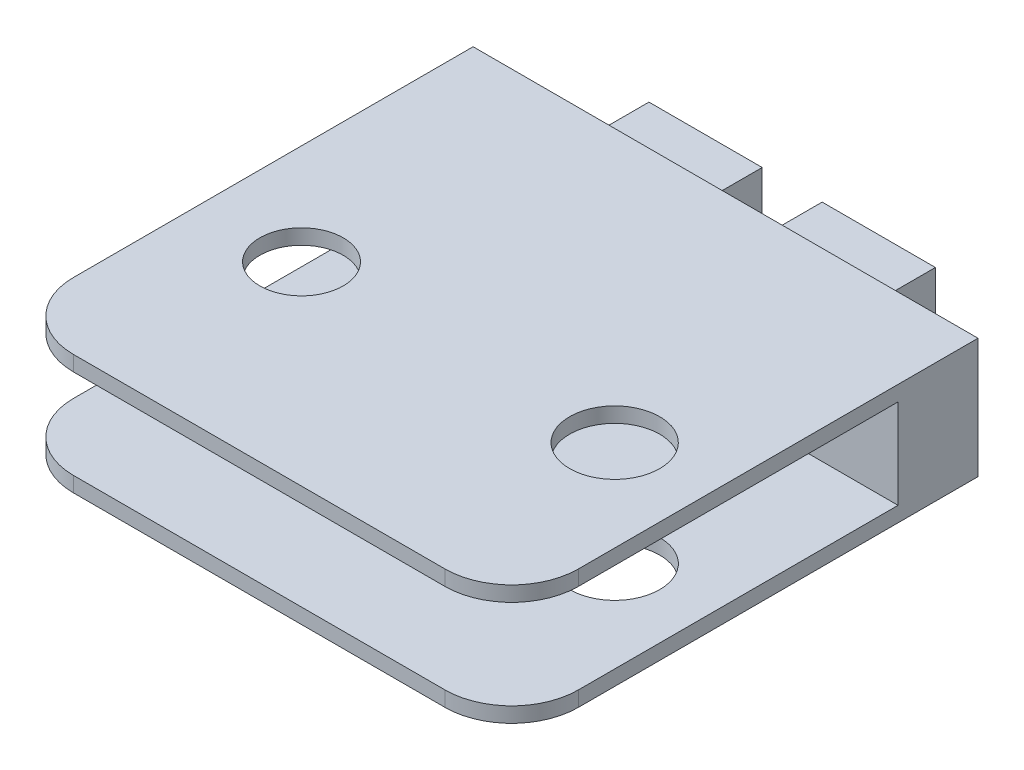
ISO-10303-21;
HEADER;
FILE_DESCRIPTION(('STEP AP214'),'2;1');
FILE_NAME('part.step','',(''),(''),'','','');
FILE_SCHEMA(('AUTOMOTIVE_DESIGN { 1 0 10303 214 1 1 1 1 }'));
ENDSEC;
DATA;
#1=APPLICATION_CONTEXT('core data for automotive mechanical design processes');
#2=APPLICATION_PROTOCOL_DEFINITION('international standard','automotive_design',2000,#1);
#3=PRODUCT_CONTEXT('',#1,'mechanical');
#4=PRODUCT('Part','Part','',(#3));
#5=PRODUCT_RELATED_PRODUCT_CATEGORY('part','',(#4));
#6=PRODUCT_DEFINITION_FORMATION('','',#4);
#7=PRODUCT_DEFINITION_CONTEXT('part definition',#1,'design');
#8=PRODUCT_DEFINITION('design','',#6,#7);
#9=PRODUCT_DEFINITION_SHAPE('','',#8);
#10=(LENGTH_UNIT() NAMED_UNIT(*) SI_UNIT(.MILLI.,.METRE.));
#11=(NAMED_UNIT(*) PLANE_ANGLE_UNIT() SI_UNIT($,.RADIAN.));
#12=(NAMED_UNIT(*) SI_UNIT($,.STERADIAN.) SOLID_ANGLE_UNIT());
#13=UNCERTAINTY_MEASURE_WITH_UNIT(LENGTH_MEASURE(1.E-05),#10,'distance_accuracy_value','');
#14=(GEOMETRIC_REPRESENTATION_CONTEXT(3) GLOBAL_UNCERTAINTY_ASSIGNED_CONTEXT((#13)) GLOBAL_UNIT_ASSIGNED_CONTEXT((#10,
#11,#12)) REPRESENTATION_CONTEXT('',''));
#15=CARTESIAN_POINT('',(0.,0.,0.));
#16=DIRECTION('',(0.,0.,1.));
#17=DIRECTION('',(1.,0.,0.));
#18=AXIS2_PLACEMENT_3D('',#15,#16,#17);
#19=CARTESIAN_POINT('',(0.,0.,-10.));
#20=DIRECTION('',(0.,0.,-1.));
#21=DIRECTION('',(-1.,0.,0.));
#22=AXIS2_PLACEMENT_3D('',#19,#20,#21);
#23=PLANE('',#22);
#24=DIRECTION('',(1.,0.,0.));
#25=VECTOR('',#24,1.);
#26=CARTESIAN_POINT('',(21.5,5.,-10.));
#27=LINE('',#26,#25);
#28=CARTESIAN_POINT('',(4.5,5.,-10.));
#29=VERTEX_POINT('',#28);
#30=CARTESIAN_POINT('',(21.5,5.,-10.));
#31=VERTEX_POINT('',#30);
#32=EDGE_CURVE('E203',#29,#31,#27,.T.);
#33=ORIENTED_EDGE('',*,*,#32,.F.);
#34=DIRECTION('',(0.,1.,0.));
#35=VECTOR('',#34,1.);
#36=CARTESIAN_POINT('',(4.5,5.,-10.));
#37=LINE('',#36,#35);
#38=CARTESIAN_POINT('',(4.5,-5.,-10.));
#39=VERTEX_POINT('',#38);
#40=EDGE_CURVE('E200',#39,#29,#37,.T.);
#41=ORIENTED_EDGE('',*,*,#40,.F.);
#42=DIRECTION('',(-1.,0.,0.));
#43=VECTOR('',#42,1.);
#44=CARTESIAN_POINT('',(21.5,-5.,-10.));
#45=LINE('',#44,#43);
#46=CARTESIAN_POINT('',(21.5,-5.,-10.));
#47=VERTEX_POINT('',#46);
#48=EDGE_CURVE('E213',#47,#39,#45,.T.);
#49=ORIENTED_EDGE('',*,*,#48,.F.);
#50=DIRECTION('',(0.,-1.,0.));
#51=VECTOR('',#50,1.);
#52=CARTESIAN_POINT('',(21.5,5.,-10.));
#53=LINE('',#52,#51);
#54=EDGE_CURVE('E221',#31,#47,#53,.T.);
#55=ORIENTED_EDGE('',*,*,#54,.F.);
#56=EDGE_LOOP('',(#33,#41,#49,#55));
#57=FACE_BOUND('',#56,.T.);
#58=DIRECTION('',(0.,-1.,0.));
#59=VECTOR('',#58,1.);
#60=CARTESIAN_POINT('',(37.895,9.,-10.));
#61=LINE('',#60,#59);
#62=CARTESIAN_POINT('',(37.895,9.,-10.));
#63=VERTEX_POINT('',#62);
#64=CARTESIAN_POINT('',(37.895,-9.,-10.));
#65=VERTEX_POINT('',#64);
#66=EDGE_CURVE('E234',#63,#65,#61,.T.);
#67=ORIENTED_EDGE('',*,*,#66,.T.);
#68=DIRECTION('',(-1.,0.,0.));
#69=VECTOR('',#68,1.);
#70=CARTESIAN_POINT('',(37.895,-9.,-10.));
#71=LINE('',#70,#69);
#72=CARTESIAN_POINT('',(-37.895,-9.,-10.));
#73=VERTEX_POINT('',#72);
#74=EDGE_CURVE('E237',#65,#73,#71,.T.);
#75=ORIENTED_EDGE('',*,*,#74,.T.);
#76=DIRECTION('',(0.,1.,0.));
#77=VECTOR('',#76,1.);
#78=CARTESIAN_POINT('',(-37.895,9.,-10.));
#79=LINE('',#78,#77);
#80=CARTESIAN_POINT('',(-37.895,9.,-10.));
#81=VERTEX_POINT('',#80);
#82=EDGE_CURVE('E240',#73,#81,#79,.T.);
#83=ORIENTED_EDGE('',*,*,#82,.T.);
#84=DIRECTION('',(1.,0.,0.));
#85=VECTOR('',#84,1.);
#86=CARTESIAN_POINT('',(37.895,9.,-10.));
#87=LINE('',#86,#85);
#88=EDGE_CURVE('E243',#81,#63,#87,.T.);
#89=ORIENTED_EDGE('',*,*,#88,.T.);
#90=EDGE_LOOP('',(#67,#75,#83,#89));
#91=FACE_BOUND('',#90,.T.);
#92=DIRECTION('',(1.,0.,0.));
#93=VECTOR('',#92,1.);
#94=CARTESIAN_POINT('',(-4.5,5.,-10.));
#95=LINE('',#94,#93);
#96=CARTESIAN_POINT('',(-21.5,5.,-10.));
#97=VERTEX_POINT('',#96);
#98=CARTESIAN_POINT('',(-4.5,5.,-10.));
#99=VERTEX_POINT('',#98);
#100=EDGE_CURVE('E662',#97,#99,#95,.T.);
#101=ORIENTED_EDGE('',*,*,#100,.F.);
#102=DIRECTION('',(0.,1.,0.));
#103=VECTOR('',#102,1.);
#104=CARTESIAN_POINT('',(-21.5,5.,-10.));
#105=LINE('',#104,#103);
#106=CARTESIAN_POINT('',(-21.5,-5.,-10.));
#107=VERTEX_POINT('',#106);
#108=EDGE_CURVE('E198',#107,#97,#105,.T.);
#109=ORIENTED_EDGE('',*,*,#108,.F.);
#110=DIRECTION('',(-1.,0.,0.));
#111=VECTOR('',#110,1.);
#112=CARTESIAN_POINT('',(-4.5,-5.,-10.));
#113=LINE('',#112,#111);
#114=CARTESIAN_POINT('',(-4.5,-5.,-10.));
#115=VERTEX_POINT('',#114);
#116=EDGE_CURVE('E194',#115,#107,#113,.T.);
#117=ORIENTED_EDGE('',*,*,#116,.F.);
#118=DIRECTION('',(0.,-1.,0.));
#119=VECTOR('',#118,1.);
#120=CARTESIAN_POINT('',(-4.5,5.,-10.));
#121=LINE('',#120,#119);
#122=EDGE_CURVE('E660',#99,#115,#121,.T.);
#123=ORIENTED_EDGE('',*,*,#122,.F.);
#124=EDGE_LOOP('',(#101,#109,#117,#123));
#125=FACE_BOUND('',#124,.T.);
#126=ADVANCED_FACE('F39',(#57,#91,#125),#23,.T.);
#127=CARTESIAN_POINT('',(0.,0.,60.));
#128=DIRECTION('',(0.,0.,1.));
#129=DIRECTION('',(1.,0.,0.));
#130=AXIS2_PLACEMENT_3D('',#127,#128,#129);
#131=PLANE('',#130);
#132=DIRECTION('',(-1.,0.,0.));
#133=VECTOR('',#132,1.);
#134=CARTESIAN_POINT('',(-37.895,6.725,60.));
#135=LINE('',#134,#133);
#136=CARTESIAN_POINT('',(27.895,6.725,60.));
#137=VERTEX_POINT('',#136);
#138=CARTESIAN_POINT('',(-27.895,6.725,60.));
#139=VERTEX_POINT('',#138);
#140=EDGE_CURVE('E271',#137,#139,#135,.T.);
#141=ORIENTED_EDGE('',*,*,#140,.F.);
#142=DIRECTION('',(0.,1.,0.));
#143=VECTOR('',#142,1.);
#144=CARTESIAN_POINT('',(27.895,9.,60.));
#145=LINE('',#144,#143);
#146=CARTESIAN_POINT('',(27.895,9.,60.));
#147=VERTEX_POINT('',#146);
#148=EDGE_CURVE('E315',#137,#147,#145,.T.);
#149=ORIENTED_EDGE('',*,*,#148,.T.);
#150=DIRECTION('',(-1.,0.,0.));
#151=VECTOR('',#150,1.);
#152=CARTESIAN_POINT('',(-37.895,9.,60.));
#153=LINE('',#152,#151);
#154=CARTESIAN_POINT('',(-27.895,9.,60.));
#155=VERTEX_POINT('',#154);
#156=EDGE_CURVE('E287',#147,#155,#153,.T.);
#157=ORIENTED_EDGE('',*,*,#156,.T.);
#158=DIRECTION('',(0.,-1.,0.));
#159=VECTOR('',#158,1.);
#160=CARTESIAN_POINT('',(-27.895,6.725,60.));
#161=LINE('',#160,#159);
#162=EDGE_CURVE('E308',#155,#139,#161,.T.);
#163=ORIENTED_EDGE('',*,*,#162,.T.);
#164=EDGE_LOOP('',(#141,#149,#157,#163));
#165=FACE_BOUND('',#164,.T.);
#166=ADVANCED_FACE('F356',(#165),#131,.T.);
#167=CARTESIAN_POINT('',(37.895,9.,60.));
#168=DIRECTION('',(-1.,0.,0.));
#169=DIRECTION('',(0.,0.,1.));
#170=AXIS2_PLACEMENT_3D('',#167,#168,#169);
#171=PLANE('',#170);
#172=DIRECTION('',(0.,0.,-1.));
#173=VECTOR('',#172,1.);
#174=CARTESIAN_POINT('',(37.895,9.,60.));
#175=LINE('',#174,#173);
#176=CARTESIAN_POINT('',(37.895,9.,50.));
#177=VERTEX_POINT('',#176);
#178=EDGE_CURVE('E306',#177,#63,#175,.T.);
#179=ORIENTED_EDGE('',*,*,#178,.F.);
#180=DIRECTION('',(0.,1.,0.));
#181=VECTOR('',#180,1.);
#182=CARTESIAN_POINT('',(37.895,6.725,50.));
#183=LINE('',#182,#181);
#184=CARTESIAN_POINT('',(37.895,6.725,50.));
#185=VERTEX_POINT('',#184);
#186=EDGE_CURVE('E324',#177,#185,#183,.F.);
#187=ORIENTED_EDGE('',*,*,#186,.T.);
#188=DIRECTION('',(0.,0.,1.));
#189=VECTOR('',#188,1.);
#190=CARTESIAN_POINT('',(37.895,6.725,1.99999999999999));
#191=LINE('',#190,#189);
#192=CARTESIAN_POINT('',(37.895,6.725,1.99999999999999));
#193=VERTEX_POINT('',#192);
#194=EDGE_CURVE('E288',#193,#185,#191,.T.);
#195=ORIENTED_EDGE('',*,*,#194,.F.);
#196=DIRECTION('',(0.,1.,0.));
#197=VECTOR('',#196,1.);
#198=CARTESIAN_POINT('',(37.895,6.725,1.99999999999999));
#199=LINE('',#198,#197);
#200=CARTESIAN_POINT('',(37.895,-6.725,1.99999999999999));
#201=VERTEX_POINT('',#200);
#202=EDGE_CURVE('E274',#201,#193,#199,.T.);
#203=ORIENTED_EDGE('',*,*,#202,.F.);
#204=DIRECTION('',(0.,0.,1.));
#205=VECTOR('',#204,1.);
#206=CARTESIAN_POINT('',(37.895,-6.725,1.99999999999999));
#207=LINE('',#206,#205);
#208=CARTESIAN_POINT('',(37.895,-6.725,50.));
#209=VERTEX_POINT('',#208);
#210=EDGE_CURVE('E291',#201,#209,#207,.T.);
#211=ORIENTED_EDGE('',*,*,#210,.T.);
#212=DIRECTION('',(0.,1.,0.));
#213=VECTOR('',#212,1.);
#214=CARTESIAN_POINT('',(37.895,-9.,50.));
#215=LINE('',#214,#213);
#216=CARTESIAN_POINT('',(37.895,-9.,50.));
#217=VERTEX_POINT('',#216);
#218=EDGE_CURVE('E322',#209,#217,#215,.F.);
#219=ORIENTED_EDGE('',*,*,#218,.T.);
#220=DIRECTION('',(0.,0.,-1.));
#221=VECTOR('',#220,1.);
#222=CARTESIAN_POINT('',(37.895,-9.,60.));
#223=LINE('',#222,#221);
#224=EDGE_CURVE('E300',#217,#65,#223,.T.);
#225=ORIENTED_EDGE('',*,*,#224,.T.);
#226=ORIENTED_EDGE('',*,*,#66,.F.);
#227=EDGE_LOOP('',(#179,#187,#195,#203,#211,#219,#225,#226));
#228=FACE_BOUND('',#227,.T.);
#229=ADVANCED_FACE('F369',(#228),#171,.F.);
#230=CARTESIAN_POINT('',(-37.895,9.,60.));
#231=DIRECTION('',(0.,-1.,0.));
#232=DIRECTION('',(0.,0.,-1.));
#233=AXIS2_PLACEMENT_3D('',#230,#231,#232);
#234=PLANE('',#233);
#235=CARTESIAN_POINT('',(24.1990951042222,9.,30.8441183277008));
#236=DIRECTION('',(0.,1.,0.));
#237=DIRECTION('',(0.,0.,1.));
#238=AXIS2_PLACEMENT_3D('',#235,#236,#237);
#239=CIRCLE('',#238,6.76086956514155);
#240=CARTESIAN_POINT('',(24.1990951042222,9.,37.6049878928423));
#241=VERTEX_POINT('',#240);
#242=EDGE_CURVE('E246',#241,#241,#239,.T.);
#243=ORIENTED_EDGE('',*,*,#242,.F.);
#244=EDGE_LOOP('',(#243));
#245=FACE_BOUND('',#244,.T.);
#246=CARTESIAN_POINT('',(-22.8078017066237,9.,30.8441183277008));
#247=DIRECTION('',(0.,1.,0.));
#248=DIRECTION('',(0.,0.,1.));
#249=AXIS2_PLACEMENT_3D('',#246,#247,#248);
#250=CIRCLE('',#249,6.26086956521739);
#251=CARTESIAN_POINT('',(-22.8078017066237,9.,37.1049878929182));
#252=VERTEX_POINT('',#251);
#253=EDGE_CURVE('E256',#252,#252,#250,.T.);
#254=ORIENTED_EDGE('',*,*,#253,.F.);
#255=EDGE_LOOP('',(#254));
#256=FACE_BOUND('',#255,.T.);
#257=ORIENTED_EDGE('',*,*,#156,.F.);
#258=CARTESIAN_POINT('',(27.895,9.,50.));
#259=DIRECTION('',(0.,-1.,0.));
#260=DIRECTION('',(0.,0.,-1.));
#261=AXIS2_PLACEMENT_3D('',#258,#259,#260);
#262=CIRCLE('',#261,10.);
#263=EDGE_CURVE('E320',#147,#177,#262,.F.);
#264=ORIENTED_EDGE('',*,*,#263,.T.);
#265=ORIENTED_EDGE('',*,*,#178,.T.);
#266=ORIENTED_EDGE('',*,*,#88,.F.);
#267=DIRECTION('',(0.,0.,-1.));
#268=VECTOR('',#267,1.);
#269=CARTESIAN_POINT('',(-37.895,9.,60.));
#270=LINE('',#269,#268);
#271=CARTESIAN_POINT('',(-37.895,9.,50.));
#272=VERTEX_POINT('',#271);
#273=EDGE_CURVE('E304',#272,#81,#270,.T.);
#274=ORIENTED_EDGE('',*,*,#273,.F.);
#275=CARTESIAN_POINT('',(-27.895,9.,50.));
#276=DIRECTION('',(0.,-1.,0.));
#277=DIRECTION('',(0.,0.,-1.));
#278=AXIS2_PLACEMENT_3D('',#275,#276,#277);
#279=CIRCLE('',#278,10.);
#280=EDGE_CURVE('E318',#272,#155,#279,.F.);
#281=ORIENTED_EDGE('',*,*,#280,.T.);
#282=EDGE_LOOP('',(#257,#264,#265,#266,#274,#281));
#283=FACE_BOUND('',#282,.T.);
#284=ADVANCED_FACE('F352',(#245,#256,#283),#234,.F.);
#285=CARTESIAN_POINT('',(-37.895,9.,60.));
#286=DIRECTION('',(1.,0.,0.));
#287=DIRECTION('',(0.,0.,-1.));
#288=AXIS2_PLACEMENT_3D('',#285,#286,#287);
#289=PLANE('',#288);
#290=DIRECTION('',(0.,0.,-1.));
#291=VECTOR('',#290,1.);
#292=CARTESIAN_POINT('',(-37.895,-9.,60.));
#293=LINE('',#292,#291);
#294=CARTESIAN_POINT('',(-37.895,-9.,50.));
#295=VERTEX_POINT('',#294);
#296=EDGE_CURVE('E302',#295,#73,#293,.T.);
#297=ORIENTED_EDGE('',*,*,#296,.F.);
#298=DIRECTION('',(0.,-1.,0.));
#299=VECTOR('',#298,1.);
#300=CARTESIAN_POINT('',(-37.895,-6.725,50.));
#301=LINE('',#300,#299);
#302=CARTESIAN_POINT('',(-37.895,-6.725,50.));
#303=VERTEX_POINT('',#302);
#304=EDGE_CURVE('E11',#295,#303,#301,.F.);
#305=ORIENTED_EDGE('',*,*,#304,.T.);
#306=DIRECTION('',(0.,0.,1.));
#307=VECTOR('',#306,1.);
#308=CARTESIAN_POINT('',(-37.895,-6.725,1.99999999999999));
#309=LINE('',#308,#307);
#310=CARTESIAN_POINT('',(-37.895,-6.725,1.99999999999999));
#311=VERTEX_POINT('',#310);
#312=EDGE_CURVE('E279',#311,#303,#309,.T.);
#313=ORIENTED_EDGE('',*,*,#312,.F.);
#314=DIRECTION('',(0.,-1.,0.));
#315=VECTOR('',#314,1.);
#316=CARTESIAN_POINT('',(-37.895,6.725,1.99999999999999));
#317=LINE('',#316,#315);
#318=CARTESIAN_POINT('',(-37.895,6.725,1.99999999999999));
#319=VERTEX_POINT('',#318);
#320=EDGE_CURVE('E267',#319,#311,#317,.T.);
#321=ORIENTED_EDGE('',*,*,#320,.F.);
#322=DIRECTION('',(0.,0.,1.));
#323=VECTOR('',#322,1.);
#324=CARTESIAN_POINT('',(-37.895,6.725,1.99999999999999));
#325=LINE('',#324,#323);
#326=CARTESIAN_POINT('',(-37.895,6.725,50.));
#327=VERTEX_POINT('',#326);
#328=EDGE_CURVE('E284',#319,#327,#325,.T.);
#329=ORIENTED_EDGE('',*,*,#328,.T.);
#330=DIRECTION('',(0.,-1.,0.));
#331=VECTOR('',#330,1.);
#332=CARTESIAN_POINT('',(-37.895,9.,50.));
#333=LINE('',#332,#331);
#334=EDGE_CURVE('E47',#327,#272,#333,.F.);
#335=ORIENTED_EDGE('',*,*,#334,.T.);
#336=ORIENTED_EDGE('',*,*,#273,.T.);
#337=ORIENTED_EDGE('',*,*,#82,.F.);
#338=EDGE_LOOP('',(#297,#305,#313,#321,#329,#335,#336,#337));
#339=FACE_BOUND('',#338,.T.);
#340=ADVANCED_FACE('F344',(#339),#289,.F.);
#341=CARTESIAN_POINT('',(-37.895,-9.,60.));
#342=DIRECTION('',(0.,1.,0.));
#343=DIRECTION('',(0.,0.,1.));
#344=AXIS2_PLACEMENT_3D('',#341,#342,#343);
#345=PLANE('',#344);
#346=CARTESIAN_POINT('',(24.1990951042222,-9.,30.8441183277008));
#347=DIRECTION('',(0.,1.,0.));
#348=DIRECTION('',(0.,0.,1.));
#349=AXIS2_PLACEMENT_3D('',#346,#347,#348);
#350=CIRCLE('',#349,6.76086956514155);
#351=CARTESIAN_POINT('',(24.1990951042222,-9.,37.6049878928423));
#352=VERTEX_POINT('',#351);
#353=EDGE_CURVE('E247',#352,#352,#350,.T.);
#354=ORIENTED_EDGE('',*,*,#353,.T.);
#355=EDGE_LOOP('',(#354));
#356=FACE_BOUND('',#355,.T.);
#357=CARTESIAN_POINT('',(-22.8078017066237,-9.,30.8441183277008));
#358=DIRECTION('',(0.,1.,0.));
#359=DIRECTION('',(0.,0.,1.));
#360=AXIS2_PLACEMENT_3D('',#357,#358,#359);
#361=CIRCLE('',#360,6.26086956521739);
#362=CARTESIAN_POINT('',(-22.8078017066237,-9.,37.1049878929182));
#363=VERTEX_POINT('',#362);
#364=EDGE_CURVE('E257',#363,#363,#361,.T.);
#365=ORIENTED_EDGE('',*,*,#364,.T.);
#366=EDGE_LOOP('',(#365));
#367=FACE_BOUND('',#366,.T.);
#368=ORIENTED_EDGE('',*,*,#224,.F.);
#369=CARTESIAN_POINT('',(27.895,-9.,50.));
#370=DIRECTION('',(0.,1.,0.));
#371=DIRECTION('',(0.,0.,1.));
#372=AXIS2_PLACEMENT_3D('',#369,#370,#371);
#373=CIRCLE('',#372,10.);
#374=CARTESIAN_POINT('',(27.895,-9.,60.));
#375=VERTEX_POINT('',#374);
#376=EDGE_CURVE('E341',#217,#375,#373,.F.);
#377=ORIENTED_EDGE('',*,*,#376,.T.);
#378=DIRECTION('',(1.,0.,0.));
#379=VECTOR('',#378,1.);
#380=CARTESIAN_POINT('',(-37.895,-9.,60.));
#381=LINE('',#380,#379);
#382=CARTESIAN_POINT('',(-27.895,-9.,60.));
#383=VERTEX_POINT('',#382);
#384=EDGE_CURVE('E297',#383,#375,#381,.T.);
#385=ORIENTED_EDGE('',*,*,#384,.F.);
#386=CARTESIAN_POINT('',(-27.895,-9.,50.));
#387=DIRECTION('',(0.,1.,0.));
#388=DIRECTION('',(0.,0.,1.));
#389=AXIS2_PLACEMENT_3D('',#386,#387,#388);
#390=CIRCLE('',#389,10.);
#391=EDGE_CURVE('E54',#383,#295,#390,.F.);
#392=ORIENTED_EDGE('',*,*,#391,.T.);
#393=ORIENTED_EDGE('',*,*,#296,.T.);
#394=ORIENTED_EDGE('',*,*,#74,.F.);
#395=EDGE_LOOP('',(#368,#377,#385,#392,#393,#394));
#396=FACE_BOUND('',#395,.T.);
#397=ADVANCED_FACE('F435',(#356,#367,#396),#345,.F.);
#398=ORIENTED_EDGE('',*,*,#384,.T.);
#399=DIRECTION('',(0.,1.,0.));
#400=VECTOR('',#399,1.);
#401=CARTESIAN_POINT('',(27.895,-6.725,60.));
#402=LINE('',#401,#400);
#403=CARTESIAN_POINT('',(27.895,-6.725,60.));
#404=VERTEX_POINT('',#403);
#405=EDGE_CURVE('E333',#375,#404,#402,.T.);
#406=ORIENTED_EDGE('',*,*,#405,.T.);
#407=DIRECTION('',(1.,0.,0.));
#408=VECTOR('',#407,1.);
#409=CARTESIAN_POINT('',(-37.895,-6.725,60.));
#410=LINE('',#409,#408);
#411=CARTESIAN_POINT('',(-27.895,-6.725,60.));
#412=VERTEX_POINT('',#411);
#413=EDGE_CURVE('E266',#412,#404,#410,.T.);
#414=ORIENTED_EDGE('',*,*,#413,.F.);
#415=DIRECTION('',(0.,-1.,0.));
#416=VECTOR('',#415,1.);
#417=CARTESIAN_POINT('',(-27.895,-9.,60.));
#418=LINE('',#417,#416);
#419=EDGE_CURVE('E330',#412,#383,#418,.T.);
#420=ORIENTED_EDGE('',*,*,#419,.T.);
#421=EDGE_LOOP('',(#398,#406,#414,#420));
#422=FACE_BOUND('',#421,.T.);
#423=ADVANCED_FACE('F382',(#422),#131,.T.);
#424=CARTESIAN_POINT('',(-37.895,6.725,1.99999999999999));
#425=DIRECTION('',(0.,1.,0.));
#426=DIRECTION('',(0.,0.,1.));
#427=AXIS2_PLACEMENT_3D('',#424,#425,#426);
#428=PLANE('',#427);
#429=CARTESIAN_POINT('',(24.1990951042222,6.725,30.8441183277008));
#430=DIRECTION('',(0.,1.,0.));
#431=DIRECTION('',(0.,0.,1.));
#432=AXIS2_PLACEMENT_3D('',#429,#430,#431);
#433=CIRCLE('',#432,6.76086956514155);
#434=CARTESIAN_POINT('',(24.1990951042222,6.725,37.6049878928423));
#435=VERTEX_POINT('',#434);
#436=EDGE_CURVE('E253',#435,#435,#433,.T.);
#437=ORIENTED_EDGE('',*,*,#436,.T.);
#438=EDGE_LOOP('',(#437));
#439=FACE_BOUND('',#438,.T.);
#440=CARTESIAN_POINT('',(-22.8078017066237,6.725,30.8441183277008));
#441=DIRECTION('',(0.,1.,0.));
#442=DIRECTION('',(0.,0.,1.));
#443=AXIS2_PLACEMENT_3D('',#440,#441,#442);
#444=CIRCLE('',#443,6.26086956521739);
#445=CARTESIAN_POINT('',(-22.8078017066237,6.725,37.1049878929182));
#446=VERTEX_POINT('',#445);
#447=EDGE_CURVE('E263',#446,#446,#444,.T.);
#448=ORIENTED_EDGE('',*,*,#447,.T.);
#449=EDGE_LOOP('',(#448));
#450=FACE_BOUND('',#449,.T.);
#451=ORIENTED_EDGE('',*,*,#194,.T.);
#452=CARTESIAN_POINT('',(27.895,6.725,50.));
#453=DIRECTION('',(0.,1.,0.));
#454=DIRECTION('',(0.,0.,1.));
#455=AXIS2_PLACEMENT_3D('',#452,#453,#454);
#456=CIRCLE('',#455,10.);
#457=EDGE_CURVE('E328',#185,#137,#456,.F.);
#458=ORIENTED_EDGE('',*,*,#457,.T.);
#459=ORIENTED_EDGE('',*,*,#140,.T.);
#460=CARTESIAN_POINT('',(-27.895,6.725,50.));
#461=DIRECTION('',(0.,1.,0.));
#462=DIRECTION('',(0.,0.,1.));
#463=AXIS2_PLACEMENT_3D('',#460,#461,#462);
#464=CIRCLE('',#463,10.);
#465=EDGE_CURVE('E326',#139,#327,#464,.F.);
#466=ORIENTED_EDGE('',*,*,#465,.T.);
#467=ORIENTED_EDGE('',*,*,#328,.F.);
#468=DIRECTION('',(-1.,0.,0.));
#469=VECTOR('',#468,1.);
#470=CARTESIAN_POINT('',(-37.895,6.725,1.99999999999999));
#471=LINE('',#470,#469);
#472=EDGE_CURVE('E276',#193,#319,#471,.T.);
#473=ORIENTED_EDGE('',*,*,#472,.F.);
#474=EDGE_LOOP('',(#451,#458,#459,#466,#467,#473));
#475=FACE_BOUND('',#474,.T.);
#476=ADVANCED_FACE('F359',(#439,#450,#475),#428,.F.);
#477=CARTESIAN_POINT('',(-37.895,-6.725,1.99999999999999));
#478=DIRECTION('',(0.,-1.,0.));
#479=DIRECTION('',(0.,0.,-1.));
#480=AXIS2_PLACEMENT_3D('',#477,#478,#479);
#481=PLANE('',#480);
#482=CARTESIAN_POINT('',(24.1990951042222,-6.725,30.8441183277008));
#483=DIRECTION('',(0.,-1.,0.));
#484=DIRECTION('',(0.,0.,-1.));
#485=AXIS2_PLACEMENT_3D('',#482,#483,#484);
#486=CIRCLE('',#485,6.76086956514155);
#487=CARTESIAN_POINT('',(24.1990951042222,-6.725,24.0832487625592));
#488=VERTEX_POINT('',#487);
#489=EDGE_CURVE('E250',#488,#488,#486,.T.);
#490=ORIENTED_EDGE('',*,*,#489,.T.);
#491=EDGE_LOOP('',(#490));
#492=FACE_BOUND('',#491,.T.);
#493=CARTESIAN_POINT('',(-22.8078017066237,-6.725,30.8441183277008));
#494=DIRECTION('',(0.,-1.,0.));
#495=DIRECTION('',(0.,0.,-1.));
#496=AXIS2_PLACEMENT_3D('',#493,#494,#495);
#497=CIRCLE('',#496,6.26086956521739);
#498=CARTESIAN_POINT('',(-22.8078017066237,-6.725,24.5832487624834));
#499=VERTEX_POINT('',#498);
#500=EDGE_CURVE('E260',#499,#499,#497,.T.);
#501=ORIENTED_EDGE('',*,*,#500,.T.);
#502=EDGE_LOOP('',(#501));
#503=FACE_BOUND('',#502,.T.);
#504=ORIENTED_EDGE('',*,*,#413,.T.);
#505=CARTESIAN_POINT('',(27.895,-6.725,50.));
#506=DIRECTION('',(0.,-1.,0.));
#507=DIRECTION('',(0.,0.,-1.));
#508=AXIS2_PLACEMENT_3D('',#505,#506,#507);
#509=CIRCLE('',#508,10.);
#510=EDGE_CURVE('E338',#404,#209,#509,.F.);
#511=ORIENTED_EDGE('',*,*,#510,.T.);
#512=ORIENTED_EDGE('',*,*,#210,.F.);
#513=DIRECTION('',(1.,0.,0.));
#514=VECTOR('',#513,1.);
#515=CARTESIAN_POINT('',(-37.895,-6.725,1.99999999999999));
#516=LINE('',#515,#514);
#517=EDGE_CURVE('E270',#311,#201,#516,.T.);
#518=ORIENTED_EDGE('',*,*,#517,.F.);
#519=ORIENTED_EDGE('',*,*,#312,.T.);
#520=CARTESIAN_POINT('',(-27.895,-6.725,50.));
#521=DIRECTION('',(0.,-1.,0.));
#522=DIRECTION('',(0.,0.,-1.));
#523=AXIS2_PLACEMENT_3D('',#520,#521,#522);
#524=CIRCLE('',#523,10.);
#525=EDGE_CURVE('E336',#303,#412,#524,.F.);
#526=ORIENTED_EDGE('',*,*,#525,.T.);
#527=EDGE_LOOP('',(#504,#511,#512,#518,#519,#526));
#528=FACE_BOUND('',#527,.T.);
#529=ADVANCED_FACE('F380',(#492,#503,#528),#481,.F.);
#530=CARTESIAN_POINT('',(0.,0.,1.99999999999999));
#531=DIRECTION('',(0.,0.,1.));
#532=DIRECTION('',(1.,0.,0.));
#533=AXIS2_PLACEMENT_3D('',#530,#531,#532);
#534=PLANE('',#533);
#535=ORIENTED_EDGE('',*,*,#320,.T.);
#536=ORIENTED_EDGE('',*,*,#517,.T.);
#537=ORIENTED_EDGE('',*,*,#202,.T.);
#538=ORIENTED_EDGE('',*,*,#472,.T.);
#539=EDGE_LOOP('',(#535,#536,#537,#538));
#540=FACE_BOUND('',#539,.T.);
#541=ADVANCED_FACE('F390',(#540),#534,.T.);
#542=CARTESIAN_POINT('',(-22.8078017066237,-9.,30.8441183277008));
#543=DIRECTION('',(0.,1.,0.));
#544=DIRECTION('',(0.,0.,1.));
#545=AXIS2_PLACEMENT_3D('',#542,#543,#544);
#546=CYLINDRICAL_SURFACE('',#545,6.26086956521739);
#547=ORIENTED_EDGE('',*,*,#364,.F.);
#548=EDGE_LOOP('',(#547));
#549=FACE_BOUND('',#548,.T.);
#550=ORIENTED_EDGE('',*,*,#500,.F.);
#551=EDGE_LOOP('',(#550));
#552=FACE_BOUND('',#551,.T.);
#553=ADVANCED_FACE('F392',(#549,#552),#546,.F.);
#554=ORIENTED_EDGE('',*,*,#253,.T.);
#555=EDGE_LOOP('',(#554));
#556=FACE_BOUND('',#555,.T.);
#557=ORIENTED_EDGE('',*,*,#447,.F.);
#558=EDGE_LOOP('',(#557));
#559=FACE_BOUND('',#558,.T.);
#560=ADVANCED_FACE('F398',(#556,#559),#546,.F.);
#561=CARTESIAN_POINT('',(24.1990951042222,-9.,30.8441183277008));
#562=DIRECTION('',(0.,1.,0.));
#563=DIRECTION('',(0.,0.,1.));
#564=AXIS2_PLACEMENT_3D('',#561,#562,#563);
#565=CYLINDRICAL_SURFACE('',#564,6.76086956514155);
#566=ORIENTED_EDGE('',*,*,#353,.F.);
#567=EDGE_LOOP('',(#566));
#568=FACE_BOUND('',#567,.T.);
#569=ORIENTED_EDGE('',*,*,#489,.F.);
#570=EDGE_LOOP('',(#569));
#571=FACE_BOUND('',#570,.T.);
#572=ADVANCED_FACE('F418',(#568,#571),#565,.F.);
#573=ORIENTED_EDGE('',*,*,#242,.T.);
#574=EDGE_LOOP('',(#573));
#575=FACE_BOUND('',#574,.T.);
#576=ORIENTED_EDGE('',*,*,#436,.F.);
#577=EDGE_LOOP('',(#576));
#578=FACE_BOUND('',#577,.T.);
#579=ADVANCED_FACE('F416',(#575,#578),#565,.F.);
#580=CARTESIAN_POINT('',(4.5,5.,-20.));
#581=DIRECTION('',(1.,0.,0.));
#582=DIRECTION('',(0.,0.,-1.));
#583=AXIS2_PLACEMENT_3D('',#580,#581,#582);
#584=PLANE('',#583);
#585=ORIENTED_EDGE('',*,*,#40,.T.);
#586=DIRECTION('',(0.,0.,1.));
#587=VECTOR('',#586,1.);
#588=CARTESIAN_POINT('',(4.5,5.,-20.));
#589=LINE('',#588,#587);
#590=CARTESIAN_POINT('',(4.5,5.,-20.));
#591=VERTEX_POINT('',#590);
#592=EDGE_CURVE('E232',#591,#29,#589,.T.);
#593=ORIENTED_EDGE('',*,*,#592,.F.);
#594=DIRECTION('',(0.,1.,0.));
#595=VECTOR('',#594,1.);
#596=CARTESIAN_POINT('',(4.5,5.,-20.));
#597=LINE('',#596,#595);
#598=CARTESIAN_POINT('',(4.5,-5.,-20.));
#599=VERTEX_POINT('',#598);
#600=EDGE_CURVE('E209',#599,#591,#597,.T.);
#601=ORIENTED_EDGE('',*,*,#600,.F.);
#602=DIRECTION('',(0.,0.,1.));
#603=VECTOR('',#602,1.);
#604=CARTESIAN_POINT('',(4.5,-5.,-20.));
#605=LINE('',#604,#603);
#606=EDGE_CURVE('E218',#599,#39,#605,.T.);
#607=ORIENTED_EDGE('',*,*,#606,.T.);
#608=EDGE_LOOP('',(#585,#593,#601,#607));
#609=FACE_BOUND('',#608,.T.);
#610=ADVANCED_FACE('F414',(#609),#584,.F.);
#611=CARTESIAN_POINT('',(21.5,5.,-20.));
#612=DIRECTION('',(0.,-1.,0.));
#613=DIRECTION('',(0.,0.,-1.));
#614=AXIS2_PLACEMENT_3D('',#611,#612,#613);
#615=PLANE('',#614);
#616=ORIENTED_EDGE('',*,*,#32,.T.);
#617=DIRECTION('',(0.,0.,1.));
#618=VECTOR('',#617,1.);
#619=CARTESIAN_POINT('',(21.5,5.,-20.));
#620=LINE('',#619,#618);
#621=CARTESIAN_POINT('',(21.5,5.,-20.));
#622=VERTEX_POINT('',#621);
#623=EDGE_CURVE('E229',#622,#31,#620,.T.);
#624=ORIENTED_EDGE('',*,*,#623,.F.);
#625=DIRECTION('',(1.,0.,0.));
#626=VECTOR('',#625,1.);
#627=CARTESIAN_POINT('',(21.5,5.,-20.));
#628=LINE('',#627,#626);
#629=EDGE_CURVE('E212',#591,#622,#628,.T.);
#630=ORIENTED_EDGE('',*,*,#629,.F.);
#631=ORIENTED_EDGE('',*,*,#592,.T.);
#632=EDGE_LOOP('',(#616,#624,#630,#631));
#633=FACE_BOUND('',#632,.T.);
#634=ADVANCED_FACE('F599',(#633),#615,.F.);
#635=CARTESIAN_POINT('',(21.5,5.,-20.));
#636=DIRECTION('',(-1.,0.,0.));
#637=DIRECTION('',(0.,0.,1.));
#638=AXIS2_PLACEMENT_3D('',#635,#636,#637);
#639=PLANE('',#638);
#640=ORIENTED_EDGE('',*,*,#54,.T.);
#641=DIRECTION('',(0.,0.,1.));
#642=VECTOR('',#641,1.);
#643=CARTESIAN_POINT('',(21.5,-5.,-20.));
#644=LINE('',#643,#642);
#645=CARTESIAN_POINT('',(21.5,-5.,-20.));
#646=VERTEX_POINT('',#645);
#647=EDGE_CURVE('E227',#646,#47,#644,.T.);
#648=ORIENTED_EDGE('',*,*,#647,.F.);
#649=DIRECTION('',(0.,-1.,0.));
#650=VECTOR('',#649,1.);
#651=CARTESIAN_POINT('',(21.5,5.,-20.));
#652=LINE('',#651,#650);
#653=EDGE_CURVE('E215',#622,#646,#652,.T.);
#654=ORIENTED_EDGE('',*,*,#653,.F.);
#655=ORIENTED_EDGE('',*,*,#623,.T.);
#656=EDGE_LOOP('',(#640,#648,#654,#655));
#657=FACE_BOUND('',#656,.T.);
#658=ADVANCED_FACE('F589',(#657),#639,.F.);
#659=CARTESIAN_POINT('',(21.5,-5.,-20.));
#660=DIRECTION('',(0.,1.,0.));
#661=DIRECTION('',(-1.,0.,0.));
#662=AXIS2_PLACEMENT_3D('',#659,#660,#661);
#663=PLANE('',#662);
#664=ORIENTED_EDGE('',*,*,#48,.T.);
#665=ORIENTED_EDGE('',*,*,#606,.F.);
#666=DIRECTION('',(-1.,0.,0.));
#667=VECTOR('',#666,1.);
#668=CARTESIAN_POINT('',(21.5,-5.,-20.));
#669=LINE('',#668,#667);
#670=EDGE_CURVE('E217',#646,#599,#669,.T.);
#671=ORIENTED_EDGE('',*,*,#670,.F.);
#672=ORIENTED_EDGE('',*,*,#647,.T.);
#673=EDGE_LOOP('',(#664,#665,#671,#672));
#674=FACE_BOUND('',#673,.T.);
#675=ADVANCED_FACE('F579',(#674),#663,.F.);
#676=CARTESIAN_POINT('',(0.,0.,-20.));
#677=DIRECTION('',(0.,0.,-1.));
#678=DIRECTION('',(-1.,0.,0.));
#679=AXIS2_PLACEMENT_3D('',#676,#677,#678);
#680=PLANE('',#679);
#681=ORIENTED_EDGE('',*,*,#600,.T.);
#682=ORIENTED_EDGE('',*,*,#629,.T.);
#683=ORIENTED_EDGE('',*,*,#653,.T.);
#684=ORIENTED_EDGE('',*,*,#670,.T.);
#685=EDGE_LOOP('',(#681,#682,#683,#684));
#686=FACE_BOUND('',#685,.T.);
#687=ADVANCED_FACE('F570',(#686),#680,.T.);
#688=CARTESIAN_POINT('',(-21.5,5.,-20.));
#689=DIRECTION('',(1.,0.,0.));
#690=DIRECTION('',(0.,0.,-1.));
#691=AXIS2_PLACEMENT_3D('',#688,#689,#690);
#692=PLANE('',#691);
#693=ORIENTED_EDGE('',*,*,#108,.T.);
#694=DIRECTION('',(0.,0.,1.));
#695=VECTOR('',#694,1.);
#696=CARTESIAN_POINT('',(-21.5,5.,-20.));
#697=LINE('',#696,#695);
#698=CARTESIAN_POINT('',(-21.5,5.,-20.));
#699=VERTEX_POINT('',#698);
#700=EDGE_CURVE('E178',#699,#97,#697,.T.);
#701=ORIENTED_EDGE('',*,*,#700,.F.);
#702=DIRECTION('',(0.,1.,0.));
#703=VECTOR('',#702,1.);
#704=CARTESIAN_POINT('',(-21.5,5.,-20.));
#705=LINE('',#704,#703);
#706=CARTESIAN_POINT('',(-21.5,-5.,-20.));
#707=VERTEX_POINT('',#706);
#708=EDGE_CURVE('E185',#707,#699,#705,.T.);
#709=ORIENTED_EDGE('',*,*,#708,.F.);
#710=DIRECTION('',(0.,0.,1.));
#711=VECTOR('',#710,1.);
#712=CARTESIAN_POINT('',(-21.5,-5.,-20.));
#713=LINE('',#712,#711);
#714=EDGE_CURVE('E667',#707,#107,#713,.T.);
#715=ORIENTED_EDGE('',*,*,#714,.T.);
#716=EDGE_LOOP('',(#693,#701,#709,#715));
#717=FACE_BOUND('',#716,.T.);
#718=ADVANCED_FACE('F196',(#717),#692,.F.);
#719=CARTESIAN_POINT('',(-4.5,5.,-20.));
#720=DIRECTION('',(0.,-1.,0.));
#721=DIRECTION('',(0.,0.,-1.));
#722=AXIS2_PLACEMENT_3D('',#719,#720,#721);
#723=PLANE('',#722);
#724=ORIENTED_EDGE('',*,*,#100,.T.);
#725=DIRECTION('',(0.,0.,1.));
#726=VECTOR('',#725,1.);
#727=CARTESIAN_POINT('',(-4.5,5.,-20.));
#728=LINE('',#727,#726);
#729=CARTESIAN_POINT('',(-4.5,5.,-20.));
#730=VERTEX_POINT('',#729);
#731=EDGE_CURVE('E181',#730,#99,#728,.T.);
#732=ORIENTED_EDGE('',*,*,#731,.F.);
#733=DIRECTION('',(1.,0.,0.));
#734=VECTOR('',#733,1.);
#735=CARTESIAN_POINT('',(-4.5,5.,-20.));
#736=LINE('',#735,#734);
#737=EDGE_CURVE('E174',#699,#730,#736,.T.);
#738=ORIENTED_EDGE('',*,*,#737,.F.);
#739=ORIENTED_EDGE('',*,*,#700,.T.);
#740=EDGE_LOOP('',(#724,#732,#738,#739));
#741=FACE_BOUND('',#740,.T.);
#742=ADVANCED_FACE('F176',(#741),#723,.F.);
#743=CARTESIAN_POINT('',(-4.5,5.,-20.));
#744=DIRECTION('',(-1.,0.,0.));
#745=DIRECTION('',(0.,-1.,0.));
#746=AXIS2_PLACEMENT_3D('',#743,#744,#745);
#747=PLANE('',#746);
#748=ORIENTED_EDGE('',*,*,#122,.T.);
#749=DIRECTION('',(0.,0.,1.));
#750=VECTOR('',#749,1.);
#751=CARTESIAN_POINT('',(-4.5,-5.,-20.));
#752=LINE('',#751,#750);
#753=CARTESIAN_POINT('',(-4.5,-5.,-20.));
#754=VERTEX_POINT('',#753);
#755=EDGE_CURVE('E205',#754,#115,#752,.T.);
#756=ORIENTED_EDGE('',*,*,#755,.F.);
#757=DIRECTION('',(0.,-1.,0.));
#758=VECTOR('',#757,1.);
#759=CARTESIAN_POINT('',(-4.5,5.,-20.));
#760=LINE('',#759,#758);
#761=EDGE_CURVE('E184',#730,#754,#760,.T.);
#762=ORIENTED_EDGE('',*,*,#761,.F.);
#763=ORIENTED_EDGE('',*,*,#731,.T.);
#764=EDGE_LOOP('',(#748,#756,#762,#763));
#765=FACE_BOUND('',#764,.T.);
#766=ADVANCED_FACE('F543',(#765),#747,.F.);
#767=CARTESIAN_POINT('',(-4.5,-5.,-20.));
#768=DIRECTION('',(0.,1.,0.));
#769=DIRECTION('',(0.,0.,1.));
#770=AXIS2_PLACEMENT_3D('',#767,#768,#769);
#771=PLANE('',#770);
#772=ORIENTED_EDGE('',*,*,#116,.T.);
#773=ORIENTED_EDGE('',*,*,#714,.F.);
#774=DIRECTION('',(-1.,0.,0.));
#775=VECTOR('',#774,1.);
#776=CARTESIAN_POINT('',(-4.5,-5.,-20.));
#777=LINE('',#776,#775);
#778=EDGE_CURVE('E190',#754,#707,#777,.T.);
#779=ORIENTED_EDGE('',*,*,#778,.F.);
#780=ORIENTED_EDGE('',*,*,#755,.T.);
#781=EDGE_LOOP('',(#772,#773,#779,#780));
#782=FACE_BOUND('',#781,.T.);
#783=ADVANCED_FACE('F534',(#782),#771,.F.);
#784=CARTESIAN_POINT('',(0.,0.,-20.));
#785=DIRECTION('',(0.,0.,-1.));
#786=DIRECTION('',(-1.,0.,0.));
#787=AXIS2_PLACEMENT_3D('',#784,#785,#786);
#788=PLANE('',#787);
#789=ORIENTED_EDGE('',*,*,#708,.T.);
#790=ORIENTED_EDGE('',*,*,#737,.T.);
#791=ORIENTED_EDGE('',*,*,#761,.T.);
#792=ORIENTED_EDGE('',*,*,#778,.T.);
#793=EDGE_LOOP('',(#789,#790,#791,#792));
#794=FACE_BOUND('',#793,.T.);
#795=ADVANCED_FACE('F188',(#794),#788,.T.);
#796=CARTESIAN_POINT('',(27.895,0.,50.));
#797=DIRECTION('',(0.,-1.,0.));
#798=DIRECTION('',(0.,0.,-1.));
#799=AXIS2_PLACEMENT_3D('',#796,#797,#798);
#800=CYLINDRICAL_SURFACE('',#799,10.);
#801=ORIENTED_EDGE('',*,*,#457,.F.);
#802=ORIENTED_EDGE('',*,*,#186,.F.);
#803=ORIENTED_EDGE('',*,*,#263,.F.);
#804=ORIENTED_EDGE('',*,*,#148,.F.);
#805=EDGE_LOOP('',(#801,#802,#803,#804));
#806=FACE_BOUND('',#805,.T.);
#807=ADVANCED_FACE('F365',(#806),#800,.T.);
#808=CARTESIAN_POINT('',(27.895,0.,50.));
#809=DIRECTION('',(0.,-1.,0.));
#810=DIRECTION('',(0.,0.,-1.));
#811=AXIS2_PLACEMENT_3D('',#808,#809,#810);
#812=CYLINDRICAL_SURFACE('',#811,10.);
#813=ORIENTED_EDGE('',*,*,#376,.F.);
#814=ORIENTED_EDGE('',*,*,#218,.F.);
#815=ORIENTED_EDGE('',*,*,#510,.F.);
#816=ORIENTED_EDGE('',*,*,#405,.F.);
#817=EDGE_LOOP('',(#813,#814,#815,#816));
#818=FACE_BOUND('',#817,.T.);
#819=ADVANCED_FACE('F386',(#818),#812,.T.);
#820=CARTESIAN_POINT('',(-27.895,0.,50.));
#821=DIRECTION('',(0.,1.,0.));
#822=DIRECTION('',(0.,0.,1.));
#823=AXIS2_PLACEMENT_3D('',#820,#821,#822);
#824=CYLINDRICAL_SURFACE('',#823,10.);
#825=ORIENTED_EDGE('',*,*,#525,.F.);
#826=ORIENTED_EDGE('',*,*,#304,.F.);
#827=ORIENTED_EDGE('',*,*,#391,.F.);
#828=ORIENTED_EDGE('',*,*,#419,.F.);
#829=EDGE_LOOP('',(#825,#826,#827,#828));
#830=FACE_BOUND('',#829,.T.);
#831=ADVANCED_FACE('F376',(#830),#824,.T.);
#832=CARTESIAN_POINT('',(-27.895,0.,50.));
#833=DIRECTION('',(0.,1.,0.));
#834=DIRECTION('',(0.,0.,1.));
#835=AXIS2_PLACEMENT_3D('',#832,#833,#834);
#836=CYLINDRICAL_SURFACE('',#835,10.);
#837=ORIENTED_EDGE('',*,*,#280,.F.);
#838=ORIENTED_EDGE('',*,*,#334,.F.);
#839=ORIENTED_EDGE('',*,*,#465,.F.);
#840=ORIENTED_EDGE('',*,*,#162,.F.);
#841=EDGE_LOOP('',(#837,#838,#839,#840));
#842=FACE_BOUND('',#841,.T.);
#843=ADVANCED_FACE('F41',(#842),#836,.T.);
#844=CLOSED_SHELL('',(#126,#166,#229,#284,#340,#397,#423,#476,#529,#541,#553,#560,#572,#579,
#610,#634,#658,#675,#687,#718,#742,#766,#783,#795,#807,#819,#831,#843));
#845=MANIFOLD_SOLID_BREP('B2',#844);
#846=ADVANCED_BREP_SHAPE_REPRESENTATION('',(#18,#845),#14);
#847=SHAPE_DEFINITION_REPRESENTATION(#9,#846);
ENDSEC;
END-ISO-10303-21;
